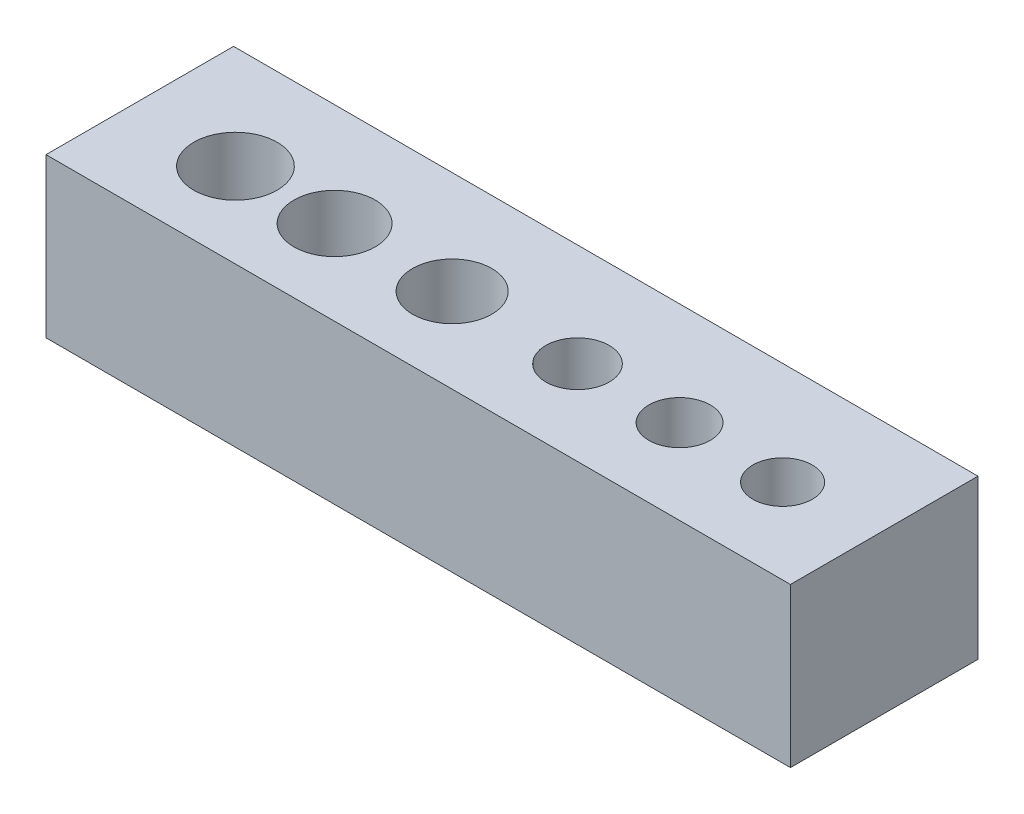
ISO-10303-21;
HEADER;
FILE_DESCRIPTION(('STEP AP214'),'2;1');
FILE_NAME('part.step','',(''),(''),'','','');
FILE_SCHEMA(('AUTOMOTIVE_DESIGN { 1 0 10303 214 1 1 1 1 }'));
ENDSEC;
DATA;
#1=APPLICATION_CONTEXT('core data for automotive mechanical design processes');
#2=APPLICATION_PROTOCOL_DEFINITION('international standard','automotive_design',2000,#1);
#3=PRODUCT_CONTEXT('',#1,'mechanical');
#4=PRODUCT('Part','Part','',(#3));
#5=PRODUCT_RELATED_PRODUCT_CATEGORY('part','',(#4));
#6=PRODUCT_DEFINITION_FORMATION('','',#4);
#7=PRODUCT_DEFINITION_CONTEXT('part definition',#1,'design');
#8=PRODUCT_DEFINITION('design','',#6,#7);
#9=PRODUCT_DEFINITION_SHAPE('','',#8);
#10=(LENGTH_UNIT() NAMED_UNIT(*) SI_UNIT(.MILLI.,.METRE.));
#11=(NAMED_UNIT(*) PLANE_ANGLE_UNIT() SI_UNIT($,.RADIAN.));
#12=(NAMED_UNIT(*) SI_UNIT($,.STERADIAN.) SOLID_ANGLE_UNIT());
#13=UNCERTAINTY_MEASURE_WITH_UNIT(LENGTH_MEASURE(1.E-05),#10,'distance_accuracy_value','');
#14=(GEOMETRIC_REPRESENTATION_CONTEXT(3) GLOBAL_UNCERTAINTY_ASSIGNED_CONTEXT((#13)) GLOBAL_UNIT_ASSIGNED_CONTEXT((#10,
#11,#12)) REPRESENTATION_CONTEXT('',''));
#15=CARTESIAN_POINT('',(0.,0.,0.));
#16=DIRECTION('',(0.,0.,1.));
#17=DIRECTION('',(1.,0.,0.));
#18=AXIS2_PLACEMENT_3D('',#15,#16,#17);
#19=CARTESIAN_POINT('',(0.,8.,0.));
#20=DIRECTION('',(0.,-1.,0.));
#21=DIRECTION('',(0.,0.,-1.));
#22=AXIS2_PLACEMENT_3D('',#19,#20,#21);
#23=PLANE('',#22);
#24=DIRECTION('',(0.,0.,-1.));
#25=VECTOR('',#24,1.);
#26=CARTESIAN_POINT('',(18.7689576457229,8.,4.18993702012874));
#27=LINE('',#26,#25);
#28=CARTESIAN_POINT('',(18.7689576457229,8.,4.18993702012874));
#29=VERTEX_POINT('',#28);
#30=CARTESIAN_POINT('',(18.7689576457229,8.,-5.26804946975252));
#31=VERTEX_POINT('',#30);
#32=EDGE_CURVE('E92',#29,#31,#27,.T.);
#33=ORIENTED_EDGE('',*,*,#32,.T.);
#34=DIRECTION('',(-1.,0.,0.));
#35=VECTOR('',#34,1.);
#36=CARTESIAN_POINT('',(-18.7689576457229,8.,-5.26804946975252));
#37=LINE('',#36,#35);
#38=CARTESIAN_POINT('',(-18.7689576457229,8.,-5.26804946975252));
#39=VERTEX_POINT('',#38);
#40=EDGE_CURVE('E87',#31,#39,#37,.T.);
#41=ORIENTED_EDGE('',*,*,#40,.T.);
#42=DIRECTION('',(0.,0.,1.));
#43=VECTOR('',#42,1.);
#44=CARTESIAN_POINT('',(-18.7689576457229,8.,4.18993702012874));
#45=LINE('',#44,#43);
#46=CARTESIAN_POINT('',(-18.7689576457229,8.,4.18993702012874));
#47=VERTEX_POINT('',#46);
#48=EDGE_CURVE('E90',#39,#47,#45,.T.);
#49=ORIENTED_EDGE('',*,*,#48,.T.);
#50=DIRECTION('',(1.,0.,0.));
#51=VECTOR('',#50,1.);
#52=CARTESIAN_POINT('',(-18.7689576457229,8.,4.18993702012874));
#53=LINE('',#52,#51);
#54=EDGE_CURVE('E57',#47,#29,#53,.T.);
#55=ORIENTED_EDGE('',*,*,#54,.T.);
#56=EDGE_LOOP('',(#33,#41,#49,#55));
#57=FACE_BOUND('',#56,.T.);
#58=CARTESIAN_POINT('',(14.102642027094,8.,-0.0807202766455857));
#59=DIRECTION('',(0.,1.,0.));
#60=DIRECTION('',(0.,0.,1.));
#61=AXIS2_PLACEMENT_3D('',#58,#59,#60);
#62=CIRCLE('',#61,1.5);
#63=CARTESIAN_POINT('',(14.102642027094,8.,1.41927972335441));
#64=VERTEX_POINT('',#63);
#65=EDGE_CURVE('E112',#64,#64,#62,.T.);
#66=ORIENTED_EDGE('',*,*,#65,.F.);
#67=EDGE_LOOP('',(#66));
#68=FACE_BOUND('',#67,.T.);
#69=CARTESIAN_POINT('',(8.9081002243613,8.,-0.0807202766455857));
#70=DIRECTION('',(0.,1.,0.));
#71=DIRECTION('',(0.,0.,1.));
#72=AXIS2_PLACEMENT_3D('',#69,#70,#71);
#73=CIRCLE('',#72,1.55);
#74=CARTESIAN_POINT('',(8.9081002243613,8.,1.46927972335441));
#75=VERTEX_POINT('',#74);
#76=EDGE_CURVE('E134',#75,#75,#73,.T.);
#77=ORIENTED_EDGE('',*,*,#76,.F.);
#78=EDGE_LOOP('',(#77));
#79=FACE_BOUND('',#78,.T.);
#80=CARTESIAN_POINT('',(3.76256353297513,8.,-0.0807202766455857));
#81=DIRECTION('',(0.,1.,0.));
#82=DIRECTION('',(0.,0.,1.));
#83=AXIS2_PLACEMENT_3D('',#80,#81,#82);
#84=CIRCLE('',#83,1.6);
#85=CARTESIAN_POINT('',(3.76256353297513,8.,1.51927972335441));
#86=VERTEX_POINT('',#85);
#87=EDGE_CURVE('E142',#86,#86,#84,.T.);
#88=ORIENTED_EDGE('',*,*,#87,.F.);
#89=EDGE_LOOP('',(#88));
#90=FACE_BOUND('',#89,.T.);
#91=CARTESIAN_POINT('',(-2.55909583072789,8.,-0.0807202766455857));
#92=DIRECTION('',(0.,1.,0.));
#93=DIRECTION('',(0.,0.,1.));
#94=AXIS2_PLACEMENT_3D('',#91,#92,#93);
#95=CIRCLE('',#94,2.);
#96=CARTESIAN_POINT('',(-2.55909583072789,8.,1.91927972335441));
#97=VERTEX_POINT('',#96);
#98=EDGE_CURVE('E150',#97,#97,#95,.T.);
#99=ORIENTED_EDGE('',*,*,#98,.F.);
#100=EDGE_LOOP('',(#99));
#101=FACE_BOUND('',#100,.T.);
#102=CARTESIAN_POINT('',(-8.4872356610052,8.,-0.0807202766455857));
#103=DIRECTION('',(0.,1.,0.));
#104=DIRECTION('',(0.,0.,1.));
#105=AXIS2_PLACEMENT_3D('',#102,#103,#104);
#106=CIRCLE('',#105,2.05);
#107=CARTESIAN_POINT('',(-8.4872356610052,8.,1.96927972335441));
#108=VERTEX_POINT('',#107);
#109=EDGE_CURVE('E158',#108,#108,#106,.T.);
#110=ORIENTED_EDGE('',*,*,#109,.F.);
#111=EDGE_LOOP('',(#110));
#112=FACE_BOUND('',#111,.T.);
#113=CARTESIAN_POINT('',(-13.4872356610052,8.,-0.0807202766455857));
#114=DIRECTION('',(0.,1.,0.));
#115=DIRECTION('',(0.,0.,1.));
#116=AXIS2_PLACEMENT_3D('',#113,#114,#115);
#117=CIRCLE('',#116,2.1);
#118=CARTESIAN_POINT('',(-13.4872356610052,8.,2.01927972335442));
#119=VERTEX_POINT('',#118);
#120=EDGE_CURVE('E166',#119,#119,#117,.T.);
#121=ORIENTED_EDGE('',*,*,#120,.F.);
#122=EDGE_LOOP('',(#121));
#123=FACE_BOUND('',#122,.T.);
#124=ADVANCED_FACE('F39',(#57,#68,#79,#90,#101,#112,#123),#23,.F.);
#125=CARTESIAN_POINT('',(0.,0.,0.));
#126=DIRECTION('',(0.,-1.,0.));
#127=DIRECTION('',(0.,0.,-1.));
#128=AXIS2_PLACEMENT_3D('',#125,#126,#127);
#129=PLANE('',#128);
#130=CARTESIAN_POINT('',(-8.4872356610052,0.,-0.0807202766455857));
#131=DIRECTION('',(0.,1.,0.));
#132=DIRECTION('',(0.,0.,1.));
#133=AXIS2_PLACEMENT_3D('',#130,#131,#132);
#134=CIRCLE('',#133,2.05);
#135=CARTESIAN_POINT('',(-8.4872356610052,0.,1.96927972335441));
#136=VERTEX_POINT('',#135);
#137=EDGE_CURVE('E162',#136,#136,#134,.T.);
#138=ORIENTED_EDGE('',*,*,#137,.T.);
#139=EDGE_LOOP('',(#138));
#140=FACE_BOUND('',#139,.T.);
#141=CARTESIAN_POINT('',(3.76256353297513,0.,-0.0807202766455857));
#142=DIRECTION('',(0.,1.,0.));
#143=DIRECTION('',(0.,0.,1.));
#144=AXIS2_PLACEMENT_3D('',#141,#142,#143);
#145=CIRCLE('',#144,1.6);
#146=CARTESIAN_POINT('',(3.76256353297513,0.,1.51927972335441));
#147=VERTEX_POINT('',#146);
#148=EDGE_CURVE('E146',#147,#147,#145,.T.);
#149=ORIENTED_EDGE('',*,*,#148,.T.);
#150=EDGE_LOOP('',(#149));
#151=FACE_BOUND('',#150,.T.);
#152=CARTESIAN_POINT('',(14.102642027094,0.,-0.0807202766455857));
#153=DIRECTION('',(0.,1.,0.));
#154=DIRECTION('',(0.,0.,1.));
#155=AXIS2_PLACEMENT_3D('',#152,#153,#154);
#156=CIRCLE('',#155,1.5);
#157=CARTESIAN_POINT('',(14.102642027094,0.,1.41927972335441));
#158=VERTEX_POINT('',#157);
#159=EDGE_CURVE('E130',#158,#158,#156,.T.);
#160=ORIENTED_EDGE('',*,*,#159,.T.);
#161=EDGE_LOOP('',(#160));
#162=FACE_BOUND('',#161,.T.);
#163=DIRECTION('',(0.,0.,-1.));
#164=VECTOR('',#163,1.);
#165=CARTESIAN_POINT('',(18.7689576457229,0.,4.18993702012874));
#166=LINE('',#165,#164);
#167=CARTESIAN_POINT('',(18.7689576457229,0.,4.18993702012874));
#168=VERTEX_POINT('',#167);
#169=CARTESIAN_POINT('',(18.7689576457229,0.,-5.26804946975252));
#170=VERTEX_POINT('',#169);
#171=EDGE_CURVE('E108',#168,#170,#166,.T.);
#172=ORIENTED_EDGE('',*,*,#171,.F.);
#173=DIRECTION('',(1.,0.,0.));
#174=VECTOR('',#173,1.);
#175=CARTESIAN_POINT('',(-18.7689576457229,0.,4.18993702012874));
#176=LINE('',#175,#174);
#177=CARTESIAN_POINT('',(-18.7689576457229,0.,4.18993702012874));
#178=VERTEX_POINT('',#177);
#179=EDGE_CURVE('E80',#178,#168,#176,.T.);
#180=ORIENTED_EDGE('',*,*,#179,.F.);
#181=DIRECTION('',(0.,0.,1.));
#182=VECTOR('',#181,1.);
#183=CARTESIAN_POINT('',(-18.7689576457229,0.,4.18993702012874));
#184=LINE('',#183,#182);
#185=CARTESIAN_POINT('',(-18.7689576457229,0.,-5.26804946975252));
#186=VERTEX_POINT('',#185);
#187=EDGE_CURVE('E74',#186,#178,#184,.T.);
#188=ORIENTED_EDGE('',*,*,#187,.F.);
#189=DIRECTION('',(-1.,0.,0.));
#190=VECTOR('',#189,1.);
#191=CARTESIAN_POINT('',(-18.7689576457229,0.,-5.26804946975252));
#192=LINE('',#191,#190);
#193=EDGE_CURVE('E97',#170,#186,#192,.T.);
#194=ORIENTED_EDGE('',*,*,#193,.F.);
#195=EDGE_LOOP('',(#172,#180,#188,#194));
#196=FACE_BOUND('',#195,.T.);
#197=CARTESIAN_POINT('',(8.9081002243613,0.,-0.0807202766455857));
#198=DIRECTION('',(0.,1.,0.));
#199=DIRECTION('',(0.,0.,1.));
#200=AXIS2_PLACEMENT_3D('',#197,#198,#199);
#201=CIRCLE('',#200,1.55);
#202=CARTESIAN_POINT('',(8.9081002243613,0.,1.46927972335441));
#203=VERTEX_POINT('',#202);
#204=EDGE_CURVE('E138',#203,#203,#201,.T.);
#205=ORIENTED_EDGE('',*,*,#204,.T.);
#206=EDGE_LOOP('',(#205));
#207=FACE_BOUND('',#206,.T.);
#208=CARTESIAN_POINT('',(-2.55909583072789,0.,-0.0807202766455857));
#209=DIRECTION('',(0.,1.,0.));
#210=DIRECTION('',(0.,0.,1.));
#211=AXIS2_PLACEMENT_3D('',#208,#209,#210);
#212=CIRCLE('',#211,2.);
#213=CARTESIAN_POINT('',(-2.55909583072789,0.,1.91927972335441));
#214=VERTEX_POINT('',#213);
#215=EDGE_CURVE('E154',#214,#214,#212,.T.);
#216=ORIENTED_EDGE('',*,*,#215,.T.);
#217=EDGE_LOOP('',(#216));
#218=FACE_BOUND('',#217,.T.);
#219=CARTESIAN_POINT('',(-13.4872356610052,0.,-0.0807202766455857));
#220=DIRECTION('',(0.,1.,0.));
#221=DIRECTION('',(0.,0.,1.));
#222=AXIS2_PLACEMENT_3D('',#219,#220,#221);
#223=CIRCLE('',#222,2.1);
#224=CARTESIAN_POINT('',(-13.4872356610052,0.,2.01927972335442));
#225=VERTEX_POINT('',#224);
#226=EDGE_CURVE('E170',#225,#225,#223,.T.);
#227=ORIENTED_EDGE('',*,*,#226,.T.);
#228=EDGE_LOOP('',(#227));
#229=FACE_BOUND('',#228,.T.);
#230=ADVANCED_FACE('F125',(#140,#151,#162,#196,#207,#218,#229),#129,.T.);
#231=CARTESIAN_POINT('',(18.7689576457229,8.,4.18993702012874));
#232=DIRECTION('',(-1.,0.,0.));
#233=DIRECTION('',(0.,0.,1.));
#234=AXIS2_PLACEMENT_3D('',#231,#232,#233);
#235=PLANE('',#234);
#236=ORIENTED_EDGE('',*,*,#171,.T.);
#237=DIRECTION('',(0.,-1.,0.));
#238=VECTOR('',#237,1.);
#239=CARTESIAN_POINT('',(18.7689576457229,8.,-5.26804946975252));
#240=LINE('',#239,#238);
#241=EDGE_CURVE('E11',#31,#170,#240,.T.);
#242=ORIENTED_EDGE('',*,*,#241,.F.);
#243=ORIENTED_EDGE('',*,*,#32,.F.);
#244=DIRECTION('',(0.,-1.,0.));
#245=VECTOR('',#244,1.);
#246=CARTESIAN_POINT('',(18.7689576457229,8.,4.18993702012874));
#247=LINE('',#246,#245);
#248=EDGE_CURVE('E104',#29,#168,#247,.T.);
#249=ORIENTED_EDGE('',*,*,#248,.T.);
#250=EDGE_LOOP('',(#236,#242,#243,#249));
#251=FACE_BOUND('',#250,.T.);
#252=ADVANCED_FACE('F41',(#251),#235,.F.);
#253=CARTESIAN_POINT('',(-18.7689576457229,8.,-5.26804946975252));
#254=DIRECTION('',(0.,0.,1.));
#255=DIRECTION('',(1.,0.,0.));
#256=AXIS2_PLACEMENT_3D('',#253,#254,#255);
#257=PLANE('',#256);
#258=ORIENTED_EDGE('',*,*,#193,.T.);
#259=DIRECTION('',(0.,-1.,0.));
#260=VECTOR('',#259,1.);
#261=CARTESIAN_POINT('',(-18.7689576457229,8.,-5.26804946975252));
#262=LINE('',#261,#260);
#263=EDGE_CURVE('E49',#39,#186,#262,.T.);
#264=ORIENTED_EDGE('',*,*,#263,.F.);
#265=ORIENTED_EDGE('',*,*,#40,.F.);
#266=ORIENTED_EDGE('',*,*,#241,.T.);
#267=EDGE_LOOP('',(#258,#264,#265,#266));
#268=FACE_BOUND('',#267,.T.);
#269=ADVANCED_FACE('F96',(#268),#257,.F.);
#270=CARTESIAN_POINT('',(-18.7689576457229,8.,4.18993702012874));
#271=DIRECTION('',(1.,0.,0.));
#272=DIRECTION('',(0.,0.,-1.));
#273=AXIS2_PLACEMENT_3D('',#270,#271,#272);
#274=PLANE('',#273);
#275=ORIENTED_EDGE('',*,*,#187,.T.);
#276=DIRECTION('',(0.,-1.,0.));
#277=VECTOR('',#276,1.);
#278=CARTESIAN_POINT('',(-18.7689576457229,8.,4.18993702012874));
#279=LINE('',#278,#277);
#280=EDGE_CURVE('E99',#47,#178,#279,.T.);
#281=ORIENTED_EDGE('',*,*,#280,.F.);
#282=ORIENTED_EDGE('',*,*,#48,.F.);
#283=ORIENTED_EDGE('',*,*,#263,.T.);
#284=EDGE_LOOP('',(#275,#281,#282,#283));
#285=FACE_BOUND('',#284,.T.);
#286=ADVANCED_FACE('F100',(#285),#274,.F.);
#287=CARTESIAN_POINT('',(-18.7689576457229,8.,4.18993702012874));
#288=DIRECTION('',(0.,0.,-1.));
#289=DIRECTION('',(-1.,0.,0.));
#290=AXIS2_PLACEMENT_3D('',#287,#288,#289);
#291=PLANE('',#290);
#292=ORIENTED_EDGE('',*,*,#179,.T.);
#293=ORIENTED_EDGE('',*,*,#248,.F.);
#294=ORIENTED_EDGE('',*,*,#54,.F.);
#295=ORIENTED_EDGE('',*,*,#280,.T.);
#296=EDGE_LOOP('',(#292,#293,#294,#295));
#297=FACE_BOUND('',#296,.T.);
#298=ADVANCED_FACE('F122',(#297),#291,.F.);
#299=CARTESIAN_POINT('',(14.102642027094,8.,-0.0807202766455857));
#300=DIRECTION('',(0.,-1.,0.));
#301=DIRECTION('',(0.,0.,-1.));
#302=AXIS2_PLACEMENT_3D('',#299,#300,#301);
#303=CYLINDRICAL_SURFACE('',#302,1.5);
#304=ORIENTED_EDGE('',*,*,#65,.T.);
#305=EDGE_LOOP('',(#304));
#306=FACE_BOUND('',#305,.T.);
#307=ORIENTED_EDGE('',*,*,#159,.F.);
#308=EDGE_LOOP('',(#307));
#309=FACE_BOUND('',#308,.T.);
#310=ADVANCED_FACE('F189',(#306,#309),#303,.F.);
#311=CARTESIAN_POINT('',(8.9081002243613,8.,-0.0807202766455857));
#312=DIRECTION('',(0.,-1.,0.));
#313=DIRECTION('',(0.,0.,-1.));
#314=AXIS2_PLACEMENT_3D('',#311,#312,#313);
#315=CYLINDRICAL_SURFACE('',#314,1.55);
#316=ORIENTED_EDGE('',*,*,#76,.T.);
#317=EDGE_LOOP('',(#316));
#318=FACE_BOUND('',#317,.T.);
#319=ORIENTED_EDGE('',*,*,#204,.F.);
#320=EDGE_LOOP('',(#319));
#321=FACE_BOUND('',#320,.T.);
#322=ADVANCED_FACE('F235',(#318,#321),#315,.F.);
#323=CARTESIAN_POINT('',(3.76256353297513,8.,-0.0807202766455857));
#324=DIRECTION('',(0.,-1.,0.));
#325=DIRECTION('',(0.,0.,-1.));
#326=AXIS2_PLACEMENT_3D('',#323,#324,#325);
#327=CYLINDRICAL_SURFACE('',#326,1.6);
#328=ORIENTED_EDGE('',*,*,#87,.T.);
#329=EDGE_LOOP('',(#328));
#330=FACE_BOUND('',#329,.T.);
#331=ORIENTED_EDGE('',*,*,#148,.F.);
#332=EDGE_LOOP('',(#331));
#333=FACE_BOUND('',#332,.T.);
#334=ADVANCED_FACE('F243',(#330,#333),#327,.F.);
#335=CARTESIAN_POINT('',(-2.55909583072789,8.,-0.0807202766455857));
#336=DIRECTION('',(0.,-1.,0.));
#337=DIRECTION('',(0.,0.,-1.));
#338=AXIS2_PLACEMENT_3D('',#335,#336,#337);
#339=CYLINDRICAL_SURFACE('',#338,2.);
#340=ORIENTED_EDGE('',*,*,#98,.T.);
#341=EDGE_LOOP('',(#340));
#342=FACE_BOUND('',#341,.T.);
#343=ORIENTED_EDGE('',*,*,#215,.F.);
#344=EDGE_LOOP('',(#343));
#345=FACE_BOUND('',#344,.T.);
#346=ADVANCED_FACE('F251',(#342,#345),#339,.F.);
#347=CARTESIAN_POINT('',(-8.4872356610052,8.,-0.0807202766455857));
#348=DIRECTION('',(0.,-1.,0.));
#349=DIRECTION('',(0.,0.,-1.));
#350=AXIS2_PLACEMENT_3D('',#347,#348,#349);
#351=CYLINDRICAL_SURFACE('',#350,2.05);
#352=ORIENTED_EDGE('',*,*,#109,.T.);
#353=EDGE_LOOP('',(#352));
#354=FACE_BOUND('',#353,.T.);
#355=ORIENTED_EDGE('',*,*,#137,.F.);
#356=EDGE_LOOP('',(#355));
#357=FACE_BOUND('',#356,.T.);
#358=ADVANCED_FACE('F260',(#354,#357),#351,.F.);
#359=CARTESIAN_POINT('',(-13.4872356610052,8.,-0.0807202766455857));
#360=DIRECTION('',(0.,-1.,0.));
#361=DIRECTION('',(0.,0.,-1.));
#362=AXIS2_PLACEMENT_3D('',#359,#360,#361);
#363=CYLINDRICAL_SURFACE('',#362,2.1);
#364=ORIENTED_EDGE('',*,*,#120,.T.);
#365=EDGE_LOOP('',(#364));
#366=FACE_BOUND('',#365,.T.);
#367=ORIENTED_EDGE('',*,*,#226,.F.);
#368=EDGE_LOOP('',(#367));
#369=FACE_BOUND('',#368,.T.);
#370=ADVANCED_FACE('F178',(#366,#369),#363,.F.);
#371=CLOSED_SHELL('',(#124,#230,#252,#269,#286,#298,#310,#322,#334,#346,#358,#370));
#372=MANIFOLD_SOLID_BREP('B2',#371);
#373=ADVANCED_BREP_SHAPE_REPRESENTATION('',(#18,#372),#14);
#374=SHAPE_DEFINITION_REPRESENTATION(#9,#373);
ENDSEC;
END-ISO-10303-21;
